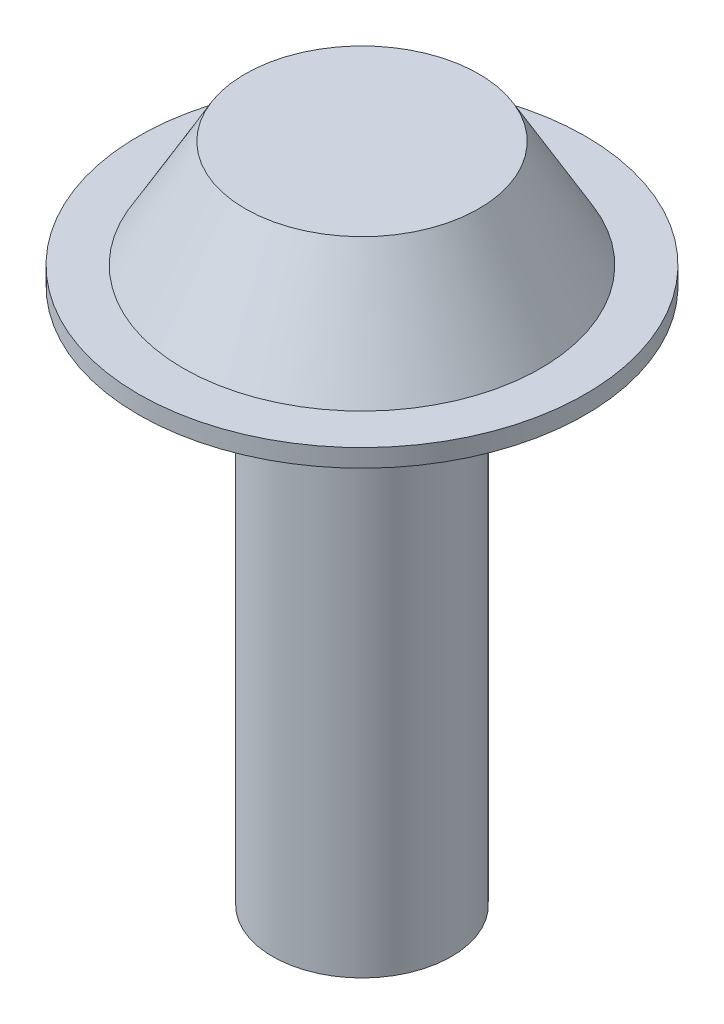
ISO-10303-21;
HEADER;
FILE_DESCRIPTION(('STEP AP214'),'2;1');
FILE_NAME('part.step','',(''),(''),'','','');
FILE_SCHEMA(('AUTOMOTIVE_DESIGN { 1 0 10303 214 1 1 1 1 }'));
ENDSEC;
DATA;
#1=APPLICATION_CONTEXT('core data for automotive mechanical design processes');
#2=APPLICATION_PROTOCOL_DEFINITION('international standard','automotive_design',2000,#1);
#3=PRODUCT_CONTEXT('',#1,'mechanical');
#4=PRODUCT('Part','Part','',(#3));
#5=PRODUCT_RELATED_PRODUCT_CATEGORY('part','',(#4));
#6=PRODUCT_DEFINITION_FORMATION('','',#4);
#7=PRODUCT_DEFINITION_CONTEXT('part definition',#1,'design');
#8=PRODUCT_DEFINITION('design','',#6,#7);
#9=PRODUCT_DEFINITION_SHAPE('','',#8);
#10=(LENGTH_UNIT() NAMED_UNIT(*) SI_UNIT(.MILLI.,.METRE.));
#11=(NAMED_UNIT(*) PLANE_ANGLE_UNIT() SI_UNIT($,.RADIAN.));
#12=(NAMED_UNIT(*) SI_UNIT($,.STERADIAN.) SOLID_ANGLE_UNIT());
#13=UNCERTAINTY_MEASURE_WITH_UNIT(LENGTH_MEASURE(1.E-05),#10,'distance_accuracy_value','');
#14=(GEOMETRIC_REPRESENTATION_CONTEXT(3) GLOBAL_UNCERTAINTY_ASSIGNED_CONTEXT((#13)) GLOBAL_UNIT_ASSIGNED_CONTEXT((#10,
#11,#12)) REPRESENTATION_CONTEXT('',''));
#15=CARTESIAN_POINT('',(0.,0.,0.));
#16=DIRECTION('',(0.,0.,1.));
#17=DIRECTION('',(1.,0.,0.));
#18=AXIS2_PLACEMENT_3D('',#15,#16,#17);
#19=CARTESIAN_POINT('',(0.,0.2,0.));
#20=DIRECTION('',(0.,-1.,0.));
#21=DIRECTION('',(0.,0.,-1.));
#22=AXIS2_PLACEMENT_3D('',#19,#20,#21);
#23=CYLINDRICAL_SURFACE('',#22,2.5);
#24=CARTESIAN_POINT('',(0.,0.2,0.));
#25=DIRECTION('',(0.,1.,0.));
#26=DIRECTION('',(0.,0.,1.));
#27=AXIS2_PLACEMENT_3D('',#24,#25,#26);
#28=CIRCLE('',#27,2.5);
#29=CARTESIAN_POINT('',(0.,0.2,2.5));
#30=VERTEX_POINT('',#29);
#31=EDGE_CURVE('E43',#30,#30,#28,.T.);
#32=ORIENTED_EDGE('',*,*,#31,.F.);
#33=EDGE_LOOP('',(#32));
#34=FACE_BOUND('',#33,.T.);
#35=CARTESIAN_POINT('',(0.,0.,0.));
#36=DIRECTION('',(0.,1.,0.));
#37=DIRECTION('',(0.,0.,1.));
#38=AXIS2_PLACEMENT_3D('',#35,#36,#37);
#39=CIRCLE('',#38,2.5);
#40=CARTESIAN_POINT('',(0.,0.,2.5));
#41=VERTEX_POINT('',#40);
#42=EDGE_CURVE('E34',#41,#41,#39,.T.);
#43=ORIENTED_EDGE('',*,*,#42,.T.);
#44=EDGE_LOOP('',(#43));
#45=FACE_BOUND('',#44,.T.);
#46=ADVANCED_FACE('F31',(#34,#45),#23,.T.);
#47=CARTESIAN_POINT('',(0.,0.2,0.));
#48=DIRECTION('',(0.,1.,0.));
#49=DIRECTION('',(0.,0.,1.));
#50=AXIS2_PLACEMENT_3D('',#47,#48,#49);
#51=PLANE('',#50);
#52=CARTESIAN_POINT('',(0.,0.2,0.));
#53=DIRECTION('',(0.,1.,0.));
#54=DIRECTION('',(0.,0.,1.));
#55=AXIS2_PLACEMENT_3D('',#52,#53,#54);
#56=CIRCLE('',#55,2.);
#57=CARTESIAN_POINT('',(0.,0.2,2.));
#58=VERTEX_POINT('',#57);
#59=EDGE_CURVE('E10',#58,#58,#56,.T.);
#60=ORIENTED_EDGE('',*,*,#59,.F.);
#61=EDGE_LOOP('',(#60));
#62=FACE_BOUND('',#61,.T.);
#63=ORIENTED_EDGE('',*,*,#31,.T.);
#64=EDGE_LOOP('',(#63));
#65=FACE_BOUND('',#64,.T.);
#66=ADVANCED_FACE('F61',(#62,#65),#51,.T.);
#67=CARTESIAN_POINT('',(0.,0.,0.));
#68=DIRECTION('',(0.,1.,0.));
#69=DIRECTION('',(0.,0.,1.));
#70=AXIS2_PLACEMENT_3D('',#67,#68,#69);
#71=PLANE('',#70);
#72=CARTESIAN_POINT('',(0.,0.,0.));
#73=DIRECTION('',(0.,-1.,0.));
#74=DIRECTION('',(0.,0.,-1.));
#75=AXIS2_PLACEMENT_3D('',#72,#73,#74);
#76=CIRCLE('',#75,1.);
#77=CARTESIAN_POINT('',(0.,0.,-1.));
#78=VERTEX_POINT('',#77);
#79=EDGE_CURVE('E38',#78,#78,#76,.T.);
#80=ORIENTED_EDGE('',*,*,#79,.F.);
#81=EDGE_LOOP('',(#80));
#82=FACE_BOUND('',#81,.T.);
#83=ORIENTED_EDGE('',*,*,#42,.F.);
#84=EDGE_LOOP('',(#83));
#85=FACE_BOUND('',#84,.T.);
#86=ADVANCED_FACE('F58',(#82,#85),#71,.F.);
#87=CARTESIAN_POINT('',(0.,-6.,0.));
#88=DIRECTION('',(0.,1.,0.));
#89=DIRECTION('',(0.,0.,1.));
#90=AXIS2_PLACEMENT_3D('',#87,#88,#89);
#91=CYLINDRICAL_SURFACE('',#90,1.);
#92=CARTESIAN_POINT('',(0.,-6.,0.));
#93=DIRECTION('',(0.,-1.,0.));
#94=DIRECTION('',(0.,0.,-1.));
#95=AXIS2_PLACEMENT_3D('',#92,#93,#94);
#96=CIRCLE('',#95,1.);
#97=CARTESIAN_POINT('',(0.,-6.,-1.));
#98=VERTEX_POINT('',#97);
#99=EDGE_CURVE('E49',#98,#98,#96,.T.);
#100=ORIENTED_EDGE('',*,*,#99,.F.);
#101=EDGE_LOOP('',(#100));
#102=FACE_BOUND('',#101,.T.);
#103=ORIENTED_EDGE('',*,*,#79,.T.);
#104=EDGE_LOOP('',(#103));
#105=FACE_BOUND('',#104,.T.);
#106=ADVANCED_FACE('F60',(#102,#105),#91,.T.);
#107=CARTESIAN_POINT('',(0.,-6.,0.));
#108=DIRECTION('',(0.,-1.,0.));
#109=DIRECTION('',(0.,0.,-1.));
#110=AXIS2_PLACEMENT_3D('',#107,#108,#109);
#111=PLANE('',#110);
#112=ORIENTED_EDGE('',*,*,#99,.T.);
#113=EDGE_LOOP('',(#112));
#114=FACE_BOUND('',#113,.T.);
#115=ADVANCED_FACE('F67',(#114),#111,.T.);
#116=CARTESIAN_POINT('',(0.,0.2,0.));
#117=DIRECTION('',(0.,-1.,0.));
#118=DIRECTION('',(0.,0.,1.));
#119=AXIS2_PLACEMENT_3D('',#116,#117,#118);
#120=CONICAL_SURFACE('',#119,2.,0.523598775598299);
#121=CARTESIAN_POINT('',(0.,1.4,0.));
#122=DIRECTION('',(0.,1.,0.));
#123=DIRECTION('',(0.,0.,1.));
#124=AXIS2_PLACEMENT_3D('',#121,#122,#123);
#125=CIRCLE('',#124,1.30717967697245);
#126=CARTESIAN_POINT('',(0.,1.4,1.30717967697245));
#127=VERTEX_POINT('',#126);
#128=EDGE_CURVE('E46',#127,#127,#125,.T.);
#129=ORIENTED_EDGE('',*,*,#128,.F.);
#130=EDGE_LOOP('',(#129));
#131=FACE_BOUND('',#130,.T.);
#132=ORIENTED_EDGE('',*,*,#59,.T.);
#133=EDGE_LOOP('',(#132));
#134=FACE_BOUND('',#133,.T.);
#135=ADVANCED_FACE('F92',(#131,#134),#120,.T.);
#136=CARTESIAN_POINT('',(0.,1.4,0.));
#137=DIRECTION('',(0.,1.,0.));
#138=DIRECTION('',(0.,0.,1.));
#139=AXIS2_PLACEMENT_3D('',#136,#137,#138);
#140=PLANE('',#139);
#141=ORIENTED_EDGE('',*,*,#128,.T.);
#142=EDGE_LOOP('',(#141));
#143=FACE_BOUND('',#142,.T.);
#144=ADVANCED_FACE('F97',(#143),#140,.T.);
#145=CLOSED_SHELL('',(#46,#66,#86,#106,#115,#135,#144));
#146=MANIFOLD_SOLID_BREP('B2',#145);
#147=ADVANCED_BREP_SHAPE_REPRESENTATION('',(#18,#146),#14);
#148=SHAPE_DEFINITION_REPRESENTATION(#9,#147);
ENDSEC;
END-ISO-10303-21;
